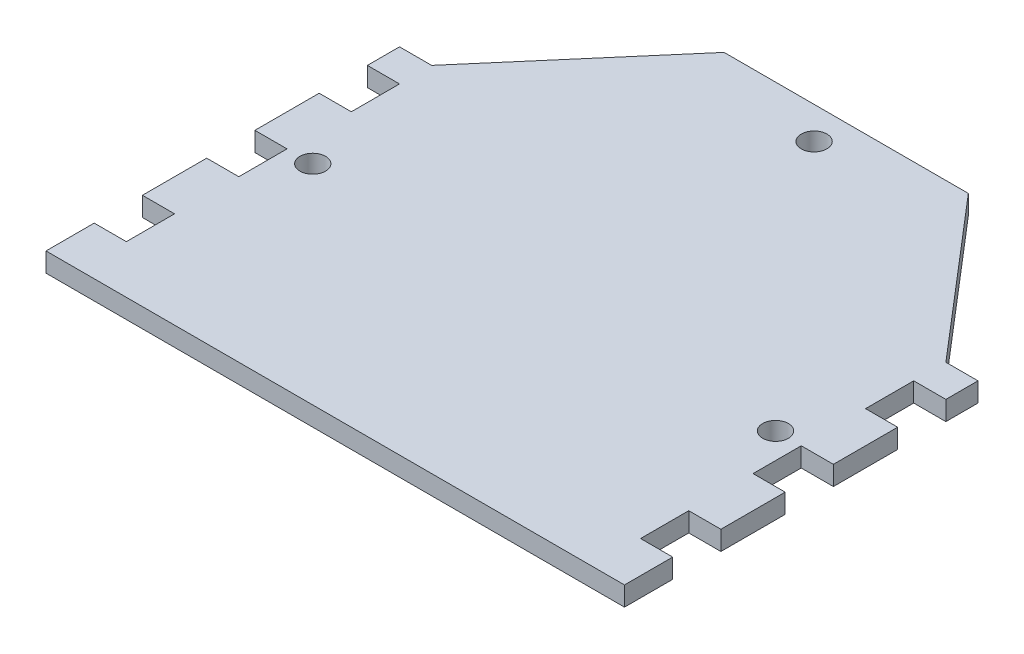
ISO-10303-21;
HEADER;
FILE_DESCRIPTION(('STEP AP214'),'2;1');
FILE_NAME('part.step','',(''),(''),'','','');
FILE_SCHEMA(('AUTOMOTIVE_DESIGN { 1 0 10303 214 1 1 1 1 }'));
ENDSEC;
DATA;
#1=APPLICATION_CONTEXT('core data for automotive mechanical design processes');
#2=APPLICATION_PROTOCOL_DEFINITION('international standard','automotive_design',2000,#1);
#3=PRODUCT_CONTEXT('',#1,'mechanical');
#4=PRODUCT('Part','Part','',(#3));
#5=PRODUCT_RELATED_PRODUCT_CATEGORY('part','',(#4));
#6=PRODUCT_DEFINITION_FORMATION('','',#4);
#7=PRODUCT_DEFINITION_CONTEXT('part definition',#1,'design');
#8=PRODUCT_DEFINITION('design','',#6,#7);
#9=PRODUCT_DEFINITION_SHAPE('','',#8);
#10=(LENGTH_UNIT() NAMED_UNIT(*) SI_UNIT(.MILLI.,.METRE.));
#11=(NAMED_UNIT(*) PLANE_ANGLE_UNIT() SI_UNIT($,.RADIAN.));
#12=(NAMED_UNIT(*) SI_UNIT($,.STERADIAN.) SOLID_ANGLE_UNIT());
#13=UNCERTAINTY_MEASURE_WITH_UNIT(LENGTH_MEASURE(1.E-05),#10,'distance_accuracy_value','');
#14=(GEOMETRIC_REPRESENTATION_CONTEXT(3) GLOBAL_UNCERTAINTY_ASSIGNED_CONTEXT((#13)) GLOBAL_UNIT_ASSIGNED_CONTEXT((#10,
#11,#12)) REPRESENTATION_CONTEXT('',''));
#15=CARTESIAN_POINT('',(0.,0.,0.));
#16=DIRECTION('',(0.,0.,1.));
#17=DIRECTION('',(1.,0.,0.));
#18=AXIS2_PLACEMENT_3D('',#15,#16,#17);
#19=CARTESIAN_POINT('',(0.,3.,0.));
#20=DIRECTION('',(0.,-1.,0.));
#21=DIRECTION('',(0.,0.,-1.));
#22=AXIS2_PLACEMENT_3D('',#19,#20,#21);
#23=PLANE('',#22);
#24=DIRECTION('',(0.,0.,1.));
#25=VECTOR('',#24,1.);
#26=CARTESIAN_POINT('',(-45.,3.,-10.5));
#27=LINE('',#26,#25);
#28=CARTESIAN_POINT('',(-45.,3.,-10.5));
#29=VERTEX_POINT('',#28);
#30=CARTESIAN_POINT('',(-45.,3.,-5.49999999999999));
#31=VERTEX_POINT('',#30);
#32=EDGE_CURVE('E340',#29,#31,#27,.T.);
#33=ORIENTED_EDGE('',*,*,#32,.T.);
#34=DIRECTION('',(1.,0.,0.));
#35=VECTOR('',#34,1.);
#36=CARTESIAN_POINT('',(-40.,3.,-5.49999999999999));
#37=LINE('',#36,#35);
#38=CARTESIAN_POINT('',(-40.,3.,-5.49999999999999));
#39=VERTEX_POINT('',#38);
#40=EDGE_CURVE('E167',#31,#39,#37,.T.);
#41=ORIENTED_EDGE('',*,*,#40,.T.);
#42=DIRECTION('',(0.,0.,1.));
#43=VECTOR('',#42,1.);
#44=CARTESIAN_POINT('',(-40.,3.,-5.49999999999999));
#45=LINE('',#44,#43);
#46=CARTESIAN_POINT('',(-40.,3.,2.00000000000001));
#47=VERTEX_POINT('',#46);
#48=EDGE_CURVE('E427',#39,#47,#45,.T.);
#49=ORIENTED_EDGE('',*,*,#48,.T.);
#50=DIRECTION('',(-1.,0.,0.));
#51=VECTOR('',#50,1.);
#52=CARTESIAN_POINT('',(-45.,3.,2.00000000000001));
#53=LINE('',#52,#51);
#54=CARTESIAN_POINT('',(-45.,3.,2.00000000000001));
#55=VERTEX_POINT('',#54);
#56=EDGE_CURVE('E446',#47,#55,#53,.T.);
#57=ORIENTED_EDGE('',*,*,#56,.T.);
#58=DIRECTION('',(0.,0.,1.));
#59=VECTOR('',#58,1.);
#60=CARTESIAN_POINT('',(-45.,3.,2.00000000000001));
#61=LINE('',#60,#59);
#62=CARTESIAN_POINT('',(-45.,3.,12.));
#63=VERTEX_POINT('',#62);
#64=EDGE_CURVE('E443',#55,#63,#61,.T.);
#65=ORIENTED_EDGE('',*,*,#64,.T.);
#66=DIRECTION('',(1.,0.,0.));
#67=VECTOR('',#66,1.);
#68=CARTESIAN_POINT('',(-40.,3.,12.));
#69=LINE('',#68,#67);
#70=CARTESIAN_POINT('',(-40.,3.,12.));
#71=VERTEX_POINT('',#70);
#72=EDGE_CURVE('E445',#63,#71,#69,.T.);
#73=ORIENTED_EDGE('',*,*,#72,.T.);
#74=DIRECTION('',(0.,0.,1.));
#75=VECTOR('',#74,1.);
#76=CARTESIAN_POINT('',(-40.,3.,12.));
#77=LINE('',#76,#75);
#78=CARTESIAN_POINT('',(-40.,3.,19.5));
#79=VERTEX_POINT('',#78);
#80=EDGE_CURVE('E448',#71,#79,#77,.T.);
#81=ORIENTED_EDGE('',*,*,#80,.T.);
#82=DIRECTION('',(-1.,0.,0.));
#83=VECTOR('',#82,1.);
#84=CARTESIAN_POINT('',(-40.,3.,19.5));
#85=LINE('',#84,#83);
#86=CARTESIAN_POINT('',(-45.,3.,19.5));
#87=VERTEX_POINT('',#86);
#88=EDGE_CURVE('E454',#79,#87,#85,.T.);
#89=ORIENTED_EDGE('',*,*,#88,.T.);
#90=DIRECTION('',(0.,0.,1.));
#91=VECTOR('',#90,1.);
#92=CARTESIAN_POINT('',(-45.,3.,19.5));
#93=LINE('',#92,#91);
#94=CARTESIAN_POINT('',(-45.,3.,29.5));
#95=VERTEX_POINT('',#94);
#96=EDGE_CURVE('E456',#87,#95,#93,.T.);
#97=ORIENTED_EDGE('',*,*,#96,.T.);
#98=DIRECTION('',(1.,0.,0.));
#99=VECTOR('',#98,1.);
#100=CARTESIAN_POINT('',(-45.,3.,29.5));
#101=LINE('',#100,#99);
#102=CARTESIAN_POINT('',(-40.,3.,29.5));
#103=VERTEX_POINT('',#102);
#104=EDGE_CURVE('E458',#95,#103,#101,.T.);
#105=ORIENTED_EDGE('',*,*,#104,.T.);
#106=DIRECTION('',(0.,0.,1.));
#107=VECTOR('',#106,1.);
#108=CARTESIAN_POINT('',(-40.,3.,29.5));
#109=LINE('',#108,#107);
#110=CARTESIAN_POINT('',(-40.,3.,37.));
#111=VERTEX_POINT('',#110);
#112=EDGE_CURVE('E460',#103,#111,#109,.T.);
#113=ORIENTED_EDGE('',*,*,#112,.T.);
#114=DIRECTION('',(-1.,0.,0.));
#115=VECTOR('',#114,1.);
#116=CARTESIAN_POINT('',(-40.,3.,37.));
#117=LINE('',#116,#115);
#118=CARTESIAN_POINT('',(-45.,3.,37.));
#119=VERTEX_POINT('',#118);
#120=EDGE_CURVE('E462',#111,#119,#117,.T.);
#121=ORIENTED_EDGE('',*,*,#120,.T.);
#122=DIRECTION('',(0.,0.,1.));
#123=VECTOR('',#122,1.);
#124=CARTESIAN_POINT('',(-45.,3.,37.));
#125=LINE('',#124,#123);
#126=CARTESIAN_POINT('',(-45.,3.,44.5));
#127=VERTEX_POINT('',#126);
#128=EDGE_CURVE('E464',#119,#127,#125,.T.);
#129=ORIENTED_EDGE('',*,*,#128,.T.);
#130=DIRECTION('',(1.,0.,0.));
#131=VECTOR('',#130,1.);
#132=CARTESIAN_POINT('',(-45.,3.,44.5));
#133=LINE('',#132,#131);
#134=CARTESIAN_POINT('',(45.,3.,44.5));
#135=VERTEX_POINT('',#134);
#136=EDGE_CURVE('E466',#127,#135,#133,.T.);
#137=ORIENTED_EDGE('',*,*,#136,.T.);
#138=DIRECTION('',(0.,0.,-1.));
#139=VECTOR('',#138,1.);
#140=CARTESIAN_POINT('',(45.,3.,37.));
#141=LINE('',#140,#139);
#142=CARTESIAN_POINT('',(45.,3.,37.));
#143=VERTEX_POINT('',#142);
#144=EDGE_CURVE('E468',#135,#143,#141,.T.);
#145=ORIENTED_EDGE('',*,*,#144,.T.);
#146=DIRECTION('',(-1.,0.,0.));
#147=VECTOR('',#146,1.);
#148=CARTESIAN_POINT('',(40.,3.,37.));
#149=LINE('',#148,#147);
#150=CARTESIAN_POINT('',(40.,3.,37.));
#151=VERTEX_POINT('',#150);
#152=EDGE_CURVE('E470',#143,#151,#149,.T.);
#153=ORIENTED_EDGE('',*,*,#152,.T.);
#154=DIRECTION('',(0.,0.,-1.));
#155=VECTOR('',#154,1.);
#156=CARTESIAN_POINT('',(40.,3.,37.));
#157=LINE('',#156,#155);
#158=CARTESIAN_POINT('',(40.,3.,29.5));
#159=VERTEX_POINT('',#158);
#160=EDGE_CURVE('E472',#151,#159,#157,.T.);
#161=ORIENTED_EDGE('',*,*,#160,.T.);
#162=DIRECTION('',(1.,0.,0.));
#163=VECTOR('',#162,1.);
#164=CARTESIAN_POINT('',(45.,3.,29.5));
#165=LINE('',#164,#163);
#166=CARTESIAN_POINT('',(45.,3.,29.5));
#167=VERTEX_POINT('',#166);
#168=EDGE_CURVE('E474',#159,#167,#165,.T.);
#169=ORIENTED_EDGE('',*,*,#168,.T.);
#170=DIRECTION('',(0.,0.,-1.));
#171=VECTOR('',#170,1.);
#172=CARTESIAN_POINT('',(45.,3.,29.5));
#173=LINE('',#172,#171);
#174=CARTESIAN_POINT('',(45.,3.,19.5));
#175=VERTEX_POINT('',#174);
#176=EDGE_CURVE('E476',#167,#175,#173,.T.);
#177=ORIENTED_EDGE('',*,*,#176,.T.);
#178=DIRECTION('',(-1.,0.,0.));
#179=VECTOR('',#178,1.);
#180=CARTESIAN_POINT('',(40.,3.,19.5));
#181=LINE('',#180,#179);
#182=CARTESIAN_POINT('',(40.,3.,19.5));
#183=VERTEX_POINT('',#182);
#184=EDGE_CURVE('E478',#175,#183,#181,.T.);
#185=ORIENTED_EDGE('',*,*,#184,.T.);
#186=DIRECTION('',(0.,0.,-1.));
#187=VECTOR('',#186,1.);
#188=CARTESIAN_POINT('',(40.,3.,12.));
#189=LINE('',#188,#187);
#190=CARTESIAN_POINT('',(40.,3.,12.));
#191=VERTEX_POINT('',#190);
#192=EDGE_CURVE('E480',#183,#191,#189,.T.);
#193=ORIENTED_EDGE('',*,*,#192,.T.);
#194=DIRECTION('',(1.,0.,0.));
#195=VECTOR('',#194,1.);
#196=CARTESIAN_POINT('',(40.,3.,12.));
#197=LINE('',#196,#195);
#198=CARTESIAN_POINT('',(45.,3.,12.));
#199=VERTEX_POINT('',#198);
#200=EDGE_CURVE('E482',#191,#199,#197,.T.);
#201=ORIENTED_EDGE('',*,*,#200,.T.);
#202=DIRECTION('',(0.,0.,-1.));
#203=VECTOR('',#202,1.);
#204=CARTESIAN_POINT('',(45.,3.,12.));
#205=LINE('',#204,#203);
#206=CARTESIAN_POINT('',(45.,3.,2.00000000000001));
#207=VERTEX_POINT('',#206);
#208=EDGE_CURVE('E484',#199,#207,#205,.T.);
#209=ORIENTED_EDGE('',*,*,#208,.T.);
#210=DIRECTION('',(-1.,0.,0.));
#211=VECTOR('',#210,1.);
#212=CARTESIAN_POINT('',(45.,3.,2.00000000000001));
#213=LINE('',#212,#211);
#214=CARTESIAN_POINT('',(40.,3.,2.00000000000001));
#215=VERTEX_POINT('',#214);
#216=EDGE_CURVE('E486',#207,#215,#213,.T.);
#217=ORIENTED_EDGE('',*,*,#216,.T.);
#218=DIRECTION('',(0.,0.,-1.));
#219=VECTOR('',#218,1.);
#220=CARTESIAN_POINT('',(40.,3.,-5.49999999999999));
#221=LINE('',#220,#219);
#222=CARTESIAN_POINT('',(40.,3.,-5.49999999999999));
#223=VERTEX_POINT('',#222);
#224=EDGE_CURVE('E488',#215,#223,#221,.T.);
#225=ORIENTED_EDGE('',*,*,#224,.T.);
#226=DIRECTION('',(1.,0.,0.));
#227=VECTOR('',#226,1.);
#228=CARTESIAN_POINT('',(40.,3.,-5.49999999999999));
#229=LINE('',#228,#227);
#230=CARTESIAN_POINT('',(45.,3.,-5.49999999999999));
#231=VERTEX_POINT('',#230);
#232=EDGE_CURVE('E490',#223,#231,#229,.T.);
#233=ORIENTED_EDGE('',*,*,#232,.T.);
#234=DIRECTION('',(0.,0.,-1.));
#235=VECTOR('',#234,1.);
#236=CARTESIAN_POINT('',(45.,3.,-10.5));
#237=LINE('',#236,#235);
#238=CARTESIAN_POINT('',(45.,3.,-10.5));
#239=VERTEX_POINT('',#238);
#240=EDGE_CURVE('E492',#231,#239,#237,.T.);
#241=ORIENTED_EDGE('',*,*,#240,.T.);
#242=DIRECTION('',(-1.,0.,0.));
#243=VECTOR('',#242,1.);
#244=CARTESIAN_POINT('',(40.,3.,-10.5));
#245=LINE('',#244,#243);
#246=CARTESIAN_POINT('',(40.,3.,-10.5));
#247=VERTEX_POINT('',#246);
#248=EDGE_CURVE('E494',#239,#247,#245,.T.);
#249=ORIENTED_EDGE('',*,*,#248,.T.);
#250=DIRECTION('',(-0.650791373455968,0.,-0.759256602365297));
#251=VECTOR('',#250,1.);
#252=CARTESIAN_POINT('',(19.,3.,-35.));
#253=LINE('',#252,#251);
#254=CARTESIAN_POINT('',(19.,3.,-35.));
#255=VERTEX_POINT('',#254);
#256=EDGE_CURVE('E258',#247,#255,#253,.T.);
#257=ORIENTED_EDGE('',*,*,#256,.T.);
#258=DIRECTION('',(-1.,0.,0.));
#259=VECTOR('',#258,1.);
#260=CARTESIAN_POINT('',(19.,3.,-35.));
#261=LINE('',#260,#259);
#262=CARTESIAN_POINT('',(-19.,3.,-35.));
#263=VERTEX_POINT('',#262);
#264=EDGE_CURVE('E252',#255,#263,#261,.T.);
#265=ORIENTED_EDGE('',*,*,#264,.T.);
#266=DIRECTION('',(-0.650791373455968,0.,0.759256602365297));
#267=VECTOR('',#266,1.);
#268=CARTESIAN_POINT('',(-19.,3.,-35.));
#269=LINE('',#268,#267);
#270=CARTESIAN_POINT('',(-40.,3.,-10.5));
#271=VERTEX_POINT('',#270);
#272=EDGE_CURVE('E256',#263,#271,#269,.T.);
#273=ORIENTED_EDGE('',*,*,#272,.T.);
#274=DIRECTION('',(-1.,0.,0.));
#275=VECTOR('',#274,1.);
#276=CARTESIAN_POINT('',(-40.,3.,-10.5));
#277=LINE('',#276,#275);
#278=EDGE_CURVE('E52',#271,#29,#277,.T.);
#279=ORIENTED_EDGE('',*,*,#278,.T.);
#280=EDGE_LOOP('',(#33,#41,#49,#57,#65,#73,#81,#89,#97,#105,#113,#121,#129,#137,#145,#153,#161,
#169,#177,#185,#193,#201,#209,#217,#225,#233,#241,#249,#257,#265,#273,#279));
#281=FACE_BOUND('',#280,.T.);
#282=CARTESIAN_POINT('',(-36.,3.,12.));
#283=DIRECTION('',(0.,1.,0.));
#284=DIRECTION('',(0.,0.,1.));
#285=AXIS2_PLACEMENT_3D('',#282,#283,#284);
#286=CIRCLE('',#285,2.);
#287=CARTESIAN_POINT('',(-36.,3.,14.));
#288=VERTEX_POINT('',#287);
#289=EDGE_CURVE('E280',#288,#288,#286,.T.);
#290=ORIENTED_EDGE('',*,*,#289,.F.);
#291=EDGE_LOOP('',(#290));
#292=FACE_BOUND('',#291,.T.);
#293=CARTESIAN_POINT('',(36.,3.,12.));
#294=DIRECTION('',(0.,1.,0.));
#295=DIRECTION('',(0.,0.,1.));
#296=AXIS2_PLACEMENT_3D('',#293,#294,#295);
#297=CIRCLE('',#296,2.);
#298=CARTESIAN_POINT('',(36.,3.,14.));
#299=VERTEX_POINT('',#298);
#300=EDGE_CURVE('E548',#299,#299,#297,.T.);
#301=ORIENTED_EDGE('',*,*,#300,.F.);
#302=EDGE_LOOP('',(#301));
#303=FACE_BOUND('',#302,.T.);
#304=CARTESIAN_POINT('',(0.,3.,-30.));
#305=DIRECTION('',(0.,1.,0.));
#306=DIRECTION('',(0.,0.,1.));
#307=AXIS2_PLACEMENT_3D('',#304,#305,#306);
#308=CIRCLE('',#307,2.);
#309=CARTESIAN_POINT('',(0.,3.,-28.));
#310=VERTEX_POINT('',#309);
#311=EDGE_CURVE('E539',#310,#310,#308,.T.);
#312=ORIENTED_EDGE('',*,*,#311,.F.);
#313=EDGE_LOOP('',(#312));
#314=FACE_BOUND('',#313,.T.);
#315=ADVANCED_FACE('F35',(#281,#292,#303,#314),#23,.F.);
#316=CARTESIAN_POINT('',(0.,0.,0.));
#317=DIRECTION('',(0.,-1.,0.));
#318=DIRECTION('',(0.,0.,-1.));
#319=AXIS2_PLACEMENT_3D('',#316,#317,#318);
#320=PLANE('',#319);
#321=CARTESIAN_POINT('',(36.,0.,12.));
#322=DIRECTION('',(0.,1.,0.));
#323=DIRECTION('',(0.,0.,1.));
#324=AXIS2_PLACEMENT_3D('',#321,#322,#323);
#325=CIRCLE('',#324,2.);
#326=CARTESIAN_POINT('',(36.,0.,14.));
#327=VERTEX_POINT('',#326);
#328=EDGE_CURVE('E545',#327,#327,#325,.T.);
#329=ORIENTED_EDGE('',*,*,#328,.T.);
#330=EDGE_LOOP('',(#329));
#331=FACE_BOUND('',#330,.T.);
#332=DIRECTION('',(0.,0.,1.));
#333=VECTOR('',#332,1.);
#334=CARTESIAN_POINT('',(-45.,0.,-10.5));
#335=LINE('',#334,#333);
#336=CARTESIAN_POINT('',(-45.,0.,-10.5));
#337=VERTEX_POINT('',#336);
#338=CARTESIAN_POINT('',(-45.,0.,-5.49999999999999));
#339=VERTEX_POINT('',#338);
#340=EDGE_CURVE('E276',#337,#339,#335,.T.);
#341=ORIENTED_EDGE('',*,*,#340,.F.);
#342=DIRECTION('',(-1.,0.,0.));
#343=VECTOR('',#342,1.);
#344=CARTESIAN_POINT('',(-40.,0.,-10.5));
#345=LINE('',#344,#343);
#346=CARTESIAN_POINT('',(-40.,0.,-10.5));
#347=VERTEX_POINT('',#346);
#348=EDGE_CURVE('E159',#347,#337,#345,.T.);
#349=ORIENTED_EDGE('',*,*,#348,.F.);
#350=DIRECTION('',(-0.650791373455968,0.,0.759256602365297));
#351=VECTOR('',#350,1.);
#352=CARTESIAN_POINT('',(-19.,0.,-35.));
#353=LINE('',#352,#351);
#354=CARTESIAN_POINT('',(-19.,0.,-35.));
#355=VERTEX_POINT('',#354);
#356=EDGE_CURVE('E153',#355,#347,#353,.T.);
#357=ORIENTED_EDGE('',*,*,#356,.F.);
#358=DIRECTION('',(-1.,0.,0.));
#359=VECTOR('',#358,1.);
#360=CARTESIAN_POINT('',(19.,0.,-35.));
#361=LINE('',#360,#359);
#362=CARTESIAN_POINT('',(19.,0.,-35.));
#363=VERTEX_POINT('',#362);
#364=EDGE_CURVE('E266',#363,#355,#361,.T.);
#365=ORIENTED_EDGE('',*,*,#364,.F.);
#366=DIRECTION('',(-0.650791373455968,0.,-0.759256602365297));
#367=VECTOR('',#366,1.);
#368=CARTESIAN_POINT('',(19.,0.,-35.));
#369=LINE('',#368,#367);
#370=CARTESIAN_POINT('',(40.,0.,-10.5));
#371=VERTEX_POINT('',#370);
#372=EDGE_CURVE('E335',#371,#363,#369,.T.);
#373=ORIENTED_EDGE('',*,*,#372,.F.);
#374=DIRECTION('',(-1.,0.,0.));
#375=VECTOR('',#374,1.);
#376=CARTESIAN_POINT('',(40.,0.,-10.5));
#377=LINE('',#376,#375);
#378=CARTESIAN_POINT('',(45.,0.,-10.5));
#379=VERTEX_POINT('',#378);
#380=EDGE_CURVE('E333',#379,#371,#377,.T.);
#381=ORIENTED_EDGE('',*,*,#380,.F.);
#382=DIRECTION('',(0.,0.,-1.));
#383=VECTOR('',#382,1.);
#384=CARTESIAN_POINT('',(45.,0.,-10.5));
#385=LINE('',#384,#383);
#386=CARTESIAN_POINT('',(45.,0.,-5.49999999999999));
#387=VERTEX_POINT('',#386);
#388=EDGE_CURVE('E331',#387,#379,#385,.T.);
#389=ORIENTED_EDGE('',*,*,#388,.F.);
#390=DIRECTION('',(1.,0.,0.));
#391=VECTOR('',#390,1.);
#392=CARTESIAN_POINT('',(40.,0.,-5.49999999999999));
#393=LINE('',#392,#391);
#394=CARTESIAN_POINT('',(40.,0.,-5.49999999999999));
#395=VERTEX_POINT('',#394);
#396=EDGE_CURVE('E329',#395,#387,#393,.T.);
#397=ORIENTED_EDGE('',*,*,#396,.F.);
#398=DIRECTION('',(0.,0.,-1.));
#399=VECTOR('',#398,1.);
#400=CARTESIAN_POINT('',(40.,0.,-5.49999999999999));
#401=LINE('',#400,#399);
#402=CARTESIAN_POINT('',(40.,0.,2.00000000000001));
#403=VERTEX_POINT('',#402);
#404=EDGE_CURVE('E327',#403,#395,#401,.T.);
#405=ORIENTED_EDGE('',*,*,#404,.F.);
#406=DIRECTION('',(-1.,0.,0.));
#407=VECTOR('',#406,1.);
#408=CARTESIAN_POINT('',(45.,0.,2.00000000000001));
#409=LINE('',#408,#407);
#410=CARTESIAN_POINT('',(45.,0.,2.00000000000001));
#411=VERTEX_POINT('',#410);
#412=EDGE_CURVE('E325',#411,#403,#409,.T.);
#413=ORIENTED_EDGE('',*,*,#412,.F.);
#414=DIRECTION('',(0.,0.,-1.));
#415=VECTOR('',#414,1.);
#416=CARTESIAN_POINT('',(45.,0.,12.));
#417=LINE('',#416,#415);
#418=CARTESIAN_POINT('',(45.,0.,12.));
#419=VERTEX_POINT('',#418);
#420=EDGE_CURVE('E323',#419,#411,#417,.T.);
#421=ORIENTED_EDGE('',*,*,#420,.F.);
#422=DIRECTION('',(1.,0.,0.));
#423=VECTOR('',#422,1.);
#424=CARTESIAN_POINT('',(40.,0.,12.));
#425=LINE('',#424,#423);
#426=CARTESIAN_POINT('',(40.,0.,12.));
#427=VERTEX_POINT('',#426);
#428=EDGE_CURVE('E321',#427,#419,#425,.T.);
#429=ORIENTED_EDGE('',*,*,#428,.F.);
#430=DIRECTION('',(0.,0.,-1.));
#431=VECTOR('',#430,1.);
#432=CARTESIAN_POINT('',(40.,0.,12.));
#433=LINE('',#432,#431);
#434=CARTESIAN_POINT('',(40.,0.,19.5));
#435=VERTEX_POINT('',#434);
#436=EDGE_CURVE('E319',#435,#427,#433,.T.);
#437=ORIENTED_EDGE('',*,*,#436,.F.);
#438=DIRECTION('',(-1.,0.,0.));
#439=VECTOR('',#438,1.);
#440=CARTESIAN_POINT('',(40.,0.,19.5));
#441=LINE('',#440,#439);
#442=CARTESIAN_POINT('',(45.,0.,19.5));
#443=VERTEX_POINT('',#442);
#444=EDGE_CURVE('E317',#443,#435,#441,.T.);
#445=ORIENTED_EDGE('',*,*,#444,.F.);
#446=DIRECTION('',(0.,0.,-1.));
#447=VECTOR('',#446,1.);
#448=CARTESIAN_POINT('',(45.,0.,29.5));
#449=LINE('',#448,#447);
#450=CARTESIAN_POINT('',(45.,0.,29.5));
#451=VERTEX_POINT('',#450);
#452=EDGE_CURVE('E315',#451,#443,#449,.T.);
#453=ORIENTED_EDGE('',*,*,#452,.F.);
#454=DIRECTION('',(1.,0.,0.));
#455=VECTOR('',#454,1.);
#456=CARTESIAN_POINT('',(45.,0.,29.5));
#457=LINE('',#456,#455);
#458=CARTESIAN_POINT('',(40.,0.,29.5));
#459=VERTEX_POINT('',#458);
#460=EDGE_CURVE('E313',#459,#451,#457,.T.);
#461=ORIENTED_EDGE('',*,*,#460,.F.);
#462=DIRECTION('',(0.,0.,-1.));
#463=VECTOR('',#462,1.);
#464=CARTESIAN_POINT('',(40.,0.,37.));
#465=LINE('',#464,#463);
#466=CARTESIAN_POINT('',(40.,0.,37.));
#467=VERTEX_POINT('',#466);
#468=EDGE_CURVE('E311',#467,#459,#465,.T.);
#469=ORIENTED_EDGE('',*,*,#468,.F.);
#470=DIRECTION('',(-1.,0.,0.));
#471=VECTOR('',#470,1.);
#472=CARTESIAN_POINT('',(40.,0.,37.));
#473=LINE('',#472,#471);
#474=CARTESIAN_POINT('',(45.,0.,37.));
#475=VERTEX_POINT('',#474);
#476=EDGE_CURVE('E309',#475,#467,#473,.T.);
#477=ORIENTED_EDGE('',*,*,#476,.F.);
#478=DIRECTION('',(0.,0.,-1.));
#479=VECTOR('',#478,1.);
#480=CARTESIAN_POINT('',(45.,0.,37.));
#481=LINE('',#480,#479);
#482=CARTESIAN_POINT('',(45.,0.,44.5));
#483=VERTEX_POINT('',#482);
#484=EDGE_CURVE('E307',#483,#475,#481,.T.);
#485=ORIENTED_EDGE('',*,*,#484,.F.);
#486=DIRECTION('',(1.,0.,0.));
#487=VECTOR('',#486,1.);
#488=CARTESIAN_POINT('',(45.,0.,44.5));
#489=LINE('',#488,#487);
#490=CARTESIAN_POINT('',(-45.,0.,44.5));
#491=VERTEX_POINT('',#490);
#492=EDGE_CURVE('E305',#491,#483,#489,.T.);
#493=ORIENTED_EDGE('',*,*,#492,.F.);
#494=DIRECTION('',(0.,0.,1.));
#495=VECTOR('',#494,1.);
#496=CARTESIAN_POINT('',(-45.,0.,37.));
#497=LINE('',#496,#495);
#498=CARTESIAN_POINT('',(-45.,0.,37.));
#499=VERTEX_POINT('',#498);
#500=EDGE_CURVE('E302',#499,#491,#497,.T.);
#501=ORIENTED_EDGE('',*,*,#500,.F.);
#502=DIRECTION('',(-1.,0.,0.));
#503=VECTOR('',#502,1.);
#504=CARTESIAN_POINT('',(-40.,0.,37.));
#505=LINE('',#504,#503);
#506=CARTESIAN_POINT('',(-40.,0.,37.));
#507=VERTEX_POINT('',#506);
#508=EDGE_CURVE('E300',#507,#499,#505,.T.);
#509=ORIENTED_EDGE('',*,*,#508,.F.);
#510=DIRECTION('',(0.,0.,1.));
#511=VECTOR('',#510,1.);
#512=CARTESIAN_POINT('',(-40.,0.,29.5));
#513=LINE('',#512,#511);
#514=CARTESIAN_POINT('',(-40.,0.,29.5));
#515=VERTEX_POINT('',#514);
#516=EDGE_CURVE('E298',#515,#507,#513,.T.);
#517=ORIENTED_EDGE('',*,*,#516,.F.);
#518=DIRECTION('',(1.,0.,0.));
#519=VECTOR('',#518,1.);
#520=CARTESIAN_POINT('',(-45.,0.,29.5));
#521=LINE('',#520,#519);
#522=CARTESIAN_POINT('',(-45.,0.,29.5));
#523=VERTEX_POINT('',#522);
#524=EDGE_CURVE('E296',#523,#515,#521,.T.);
#525=ORIENTED_EDGE('',*,*,#524,.F.);
#526=DIRECTION('',(0.,0.,1.));
#527=VECTOR('',#526,1.);
#528=CARTESIAN_POINT('',(-45.,0.,19.5));
#529=LINE('',#528,#527);
#530=CARTESIAN_POINT('',(-45.,0.,19.5));
#531=VERTEX_POINT('',#530);
#532=EDGE_CURVE('E294',#531,#523,#529,.T.);
#533=ORIENTED_EDGE('',*,*,#532,.F.);
#534=DIRECTION('',(-1.,0.,0.));
#535=VECTOR('',#534,1.);
#536=CARTESIAN_POINT('',(-40.,0.,19.5));
#537=LINE('',#536,#535);
#538=CARTESIAN_POINT('',(-40.,0.,19.5));
#539=VERTEX_POINT('',#538);
#540=EDGE_CURVE('E292',#539,#531,#537,.T.);
#541=ORIENTED_EDGE('',*,*,#540,.F.);
#542=DIRECTION('',(0.,0.,1.));
#543=VECTOR('',#542,1.);
#544=CARTESIAN_POINT('',(-40.,0.,12.));
#545=LINE('',#544,#543);
#546=CARTESIAN_POINT('',(-40.,0.,12.));
#547=VERTEX_POINT('',#546);
#548=EDGE_CURVE('E290',#547,#539,#545,.T.);
#549=ORIENTED_EDGE('',*,*,#548,.F.);
#550=DIRECTION('',(1.,0.,0.));
#551=VECTOR('',#550,1.);
#552=CARTESIAN_POINT('',(-40.,0.,12.));
#553=LINE('',#552,#551);
#554=CARTESIAN_POINT('',(-45.,0.,12.));
#555=VERTEX_POINT('',#554);
#556=EDGE_CURVE('E288',#555,#547,#553,.T.);
#557=ORIENTED_EDGE('',*,*,#556,.F.);
#558=DIRECTION('',(0.,0.,1.));
#559=VECTOR('',#558,1.);
#560=CARTESIAN_POINT('',(-45.,0.,2.00000000000001));
#561=LINE('',#560,#559);
#562=CARTESIAN_POINT('',(-45.,0.,2.00000000000001));
#563=VERTEX_POINT('',#562);
#564=EDGE_CURVE('E286',#563,#555,#561,.T.);
#565=ORIENTED_EDGE('',*,*,#564,.F.);
#566=DIRECTION('',(-1.,0.,0.));
#567=VECTOR('',#566,1.);
#568=CARTESIAN_POINT('',(-45.,0.,2.00000000000001));
#569=LINE('',#568,#567);
#570=CARTESIAN_POINT('',(-40.,0.,2.00000000000001));
#571=VERTEX_POINT('',#570);
#572=EDGE_CURVE('E284',#571,#563,#569,.T.);
#573=ORIENTED_EDGE('',*,*,#572,.F.);
#574=DIRECTION('',(0.,0.,1.));
#575=VECTOR('',#574,1.);
#576=CARTESIAN_POINT('',(-40.,0.,-5.49999999999999));
#577=LINE('',#576,#575);
#578=CARTESIAN_POINT('',(-40.,0.,-5.49999999999999));
#579=VERTEX_POINT('',#578);
#580=EDGE_CURVE('E282',#579,#571,#577,.T.);
#581=ORIENTED_EDGE('',*,*,#580,.F.);
#582=DIRECTION('',(1.,0.,0.));
#583=VECTOR('',#582,1.);
#584=CARTESIAN_POINT('',(-40.,0.,-5.49999999999999));
#585=LINE('',#584,#583);
#586=EDGE_CURVE('E279',#339,#579,#585,.T.);
#587=ORIENTED_EDGE('',*,*,#586,.F.);
#588=EDGE_LOOP('',(#341,#349,#357,#365,#373,#381,#389,#397,#405,#413,#421,#429,#437,#445,#453,
#461,#469,#477,#485,#493,#501,#509,#517,#525,#533,#541,#549,#557,#565,#573,#581,#587));
#589=FACE_BOUND('',#588,.T.);
#590=CARTESIAN_POINT('',(-36.,0.,12.));
#591=DIRECTION('',(0.,1.,0.));
#592=DIRECTION('',(0.,0.,1.));
#593=AXIS2_PLACEMENT_3D('',#590,#591,#592);
#594=CIRCLE('',#593,2.);
#595=CARTESIAN_POINT('',(-36.,0.,14.));
#596=VERTEX_POINT('',#595);
#597=EDGE_CURVE('E551',#596,#596,#594,.T.);
#598=ORIENTED_EDGE('',*,*,#597,.T.);
#599=EDGE_LOOP('',(#598));
#600=FACE_BOUND('',#599,.T.);
#601=CARTESIAN_POINT('',(0.,0.,-30.));
#602=DIRECTION('',(0.,1.,0.));
#603=DIRECTION('',(0.,0.,1.));
#604=AXIS2_PLACEMENT_3D('',#601,#602,#603);
#605=CIRCLE('',#604,2.);
#606=CARTESIAN_POINT('',(0.,0.,-28.));
#607=VERTEX_POINT('',#606);
#608=EDGE_CURVE('E542',#607,#607,#605,.T.);
#609=ORIENTED_EDGE('',*,*,#608,.T.);
#610=EDGE_LOOP('',(#609));
#611=FACE_BOUND('',#610,.T.);
#612=ADVANCED_FACE('F431',(#331,#589,#600,#611),#320,.T.);
#613=CARTESIAN_POINT('',(-45.,3.,-10.5));
#614=DIRECTION('',(1.,0.,0.));
#615=DIRECTION('',(0.,0.,-1.));
#616=AXIS2_PLACEMENT_3D('',#613,#614,#615);
#617=PLANE('',#616);
#618=ORIENTED_EDGE('',*,*,#340,.T.);
#619=DIRECTION('',(0.,-1.,0.));
#620=VECTOR('',#619,1.);
#621=CARTESIAN_POINT('',(-45.,3.,-5.49999999999999));
#622=LINE('',#621,#620);
#623=EDGE_CURVE('E11',#31,#339,#622,.T.);
#624=ORIENTED_EDGE('',*,*,#623,.F.);
#625=ORIENTED_EDGE('',*,*,#32,.F.);
#626=DIRECTION('',(0.,-1.,0.));
#627=VECTOR('',#626,1.);
#628=CARTESIAN_POINT('',(-45.,3.,-10.5));
#629=LINE('',#628,#627);
#630=EDGE_CURVE('E272',#29,#337,#629,.T.);
#631=ORIENTED_EDGE('',*,*,#630,.T.);
#632=EDGE_LOOP('',(#618,#624,#625,#631));
#633=FACE_BOUND('',#632,.T.);
#634=ADVANCED_FACE('F37',(#633),#617,.F.);
#635=CARTESIAN_POINT('',(-40.,3.,-5.49999999999999));
#636=DIRECTION('',(0.,0.,-1.));
#637=DIRECTION('',(-1.,0.,0.));
#638=AXIS2_PLACEMENT_3D('',#635,#636,#637);
#639=PLANE('',#638);
#640=ORIENTED_EDGE('',*,*,#586,.T.);
#641=DIRECTION('',(0.,-1.,0.));
#642=VECTOR('',#641,1.);
#643=CARTESIAN_POINT('',(-40.,3.,-5.49999999999999));
#644=LINE('',#643,#642);
#645=EDGE_CURVE('E44',#39,#579,#644,.T.);
#646=ORIENTED_EDGE('',*,*,#645,.F.);
#647=ORIENTED_EDGE('',*,*,#40,.F.);
#648=ORIENTED_EDGE('',*,*,#623,.T.);
#649=EDGE_LOOP('',(#640,#646,#647,#648));
#650=FACE_BOUND('',#649,.T.);
#651=ADVANCED_FACE('F869',(#650),#639,.F.);
#652=CARTESIAN_POINT('',(-40.,3.,-5.49999999999999));
#653=DIRECTION('',(1.,0.,0.));
#654=DIRECTION('',(0.,0.,-1.));
#655=AXIS2_PLACEMENT_3D('',#652,#653,#654);
#656=PLANE('',#655);
#657=ORIENTED_EDGE('',*,*,#580,.T.);
#658=DIRECTION('',(0.,-1.,0.));
#659=VECTOR('',#658,1.);
#660=CARTESIAN_POINT('',(-40.,3.,2.00000000000001));
#661=LINE('',#660,#659);
#662=EDGE_CURVE('E419',#47,#571,#661,.T.);
#663=ORIENTED_EDGE('',*,*,#662,.F.);
#664=ORIENTED_EDGE('',*,*,#48,.F.);
#665=ORIENTED_EDGE('',*,*,#645,.T.);
#666=EDGE_LOOP('',(#657,#663,#664,#665));
#667=FACE_BOUND('',#666,.T.);
#668=ADVANCED_FACE('F425',(#667),#656,.F.);
#669=CARTESIAN_POINT('',(-45.,3.,2.00000000000001));
#670=DIRECTION('',(0.,0.,1.));
#671=DIRECTION('',(1.,0.,0.));
#672=AXIS2_PLACEMENT_3D('',#669,#670,#671);
#673=PLANE('',#672);
#674=ORIENTED_EDGE('',*,*,#572,.T.);
#675=DIRECTION('',(0.,-1.,0.));
#676=VECTOR('',#675,1.);
#677=CARTESIAN_POINT('',(-45.,3.,2.00000000000001));
#678=LINE('',#677,#676);
#679=EDGE_CURVE('E416',#55,#563,#678,.T.);
#680=ORIENTED_EDGE('',*,*,#679,.F.);
#681=ORIENTED_EDGE('',*,*,#56,.F.);
#682=ORIENTED_EDGE('',*,*,#662,.T.);
#683=EDGE_LOOP('',(#674,#680,#681,#682));
#684=FACE_BOUND('',#683,.T.);
#685=ADVANCED_FACE('F437',(#684),#673,.F.);
#686=CARTESIAN_POINT('',(-45.,3.,2.00000000000001));
#687=DIRECTION('',(1.,0.,0.));
#688=DIRECTION('',(0.,0.,-1.));
#689=AXIS2_PLACEMENT_3D('',#686,#687,#688);
#690=PLANE('',#689);
#691=ORIENTED_EDGE('',*,*,#564,.T.);
#692=DIRECTION('',(0.,-1.,0.));
#693=VECTOR('',#692,1.);
#694=CARTESIAN_POINT('',(-45.,3.,12.));
#695=LINE('',#694,#693);
#696=EDGE_CURVE('E413',#63,#555,#695,.T.);
#697=ORIENTED_EDGE('',*,*,#696,.F.);
#698=ORIENTED_EDGE('',*,*,#64,.F.);
#699=ORIENTED_EDGE('',*,*,#679,.T.);
#700=EDGE_LOOP('',(#691,#697,#698,#699));
#701=FACE_BOUND('',#700,.T.);
#702=ADVANCED_FACE('F441',(#701),#690,.F.);
#703=CARTESIAN_POINT('',(-40.,3.,12.));
#704=DIRECTION('',(0.,0.,-1.));
#705=DIRECTION('',(-1.,0.,0.));
#706=AXIS2_PLACEMENT_3D('',#703,#704,#705);
#707=PLANE('',#706);
#708=ORIENTED_EDGE('',*,*,#556,.T.);
#709=DIRECTION('',(0.,-1.,0.));
#710=VECTOR('',#709,1.);
#711=CARTESIAN_POINT('',(-40.,3.,12.));
#712=LINE('',#711,#710);
#713=EDGE_CURVE('E410',#71,#547,#712,.T.);
#714=ORIENTED_EDGE('',*,*,#713,.F.);
#715=ORIENTED_EDGE('',*,*,#72,.F.);
#716=ORIENTED_EDGE('',*,*,#696,.T.);
#717=EDGE_LOOP('',(#708,#714,#715,#716));
#718=FACE_BOUND('',#717,.T.);
#719=ADVANCED_FACE('F834',(#718),#707,.F.);
#720=CARTESIAN_POINT('',(-40.,3.,12.));
#721=DIRECTION('',(1.,0.,0.));
#722=DIRECTION('',(0.,0.,-1.));
#723=AXIS2_PLACEMENT_3D('',#720,#721,#722);
#724=PLANE('',#723);
#725=ORIENTED_EDGE('',*,*,#548,.T.);
#726=DIRECTION('',(0.,-1.,0.));
#727=VECTOR('',#726,1.);
#728=CARTESIAN_POINT('',(-40.,3.,19.5));
#729=LINE('',#728,#727);
#730=EDGE_CURVE('E407',#79,#539,#729,.T.);
#731=ORIENTED_EDGE('',*,*,#730,.F.);
#732=ORIENTED_EDGE('',*,*,#80,.F.);
#733=ORIENTED_EDGE('',*,*,#713,.T.);
#734=EDGE_LOOP('',(#725,#731,#732,#733));
#735=FACE_BOUND('',#734,.T.);
#736=ADVANCED_FACE('F824',(#735),#724,.F.);
#737=CARTESIAN_POINT('',(-40.,3.,19.5));
#738=DIRECTION('',(0.,0.,1.));
#739=DIRECTION('',(1.,0.,0.));
#740=AXIS2_PLACEMENT_3D('',#737,#738,#739);
#741=PLANE('',#740);
#742=ORIENTED_EDGE('',*,*,#540,.T.);
#743=DIRECTION('',(0.,-1.,0.));
#744=VECTOR('',#743,1.);
#745=CARTESIAN_POINT('',(-45.,3.,19.5));
#746=LINE('',#745,#744);
#747=EDGE_CURVE('E404',#87,#531,#746,.T.);
#748=ORIENTED_EDGE('',*,*,#747,.F.);
#749=ORIENTED_EDGE('',*,*,#88,.F.);
#750=ORIENTED_EDGE('',*,*,#730,.T.);
#751=EDGE_LOOP('',(#742,#748,#749,#750));
#752=FACE_BOUND('',#751,.T.);
#753=ADVANCED_FACE('F814',(#752),#741,.F.);
#754=CARTESIAN_POINT('',(-45.,3.,19.5));
#755=DIRECTION('',(1.,0.,0.));
#756=DIRECTION('',(0.,0.,-1.));
#757=AXIS2_PLACEMENT_3D('',#754,#755,#756);
#758=PLANE('',#757);
#759=ORIENTED_EDGE('',*,*,#532,.T.);
#760=DIRECTION('',(0.,-1.,0.));
#761=VECTOR('',#760,1.);
#762=CARTESIAN_POINT('',(-45.,3.,29.5));
#763=LINE('',#762,#761);
#764=EDGE_CURVE('E401',#95,#523,#763,.T.);
#765=ORIENTED_EDGE('',*,*,#764,.F.);
#766=ORIENTED_EDGE('',*,*,#96,.F.);
#767=ORIENTED_EDGE('',*,*,#747,.T.);
#768=EDGE_LOOP('',(#759,#765,#766,#767));
#769=FACE_BOUND('',#768,.T.);
#770=ADVANCED_FACE('F804',(#769),#758,.F.);
#771=CARTESIAN_POINT('',(-45.,3.,29.5));
#772=DIRECTION('',(0.,0.,-1.));
#773=DIRECTION('',(-1.,0.,0.));
#774=AXIS2_PLACEMENT_3D('',#771,#772,#773);
#775=PLANE('',#774);
#776=ORIENTED_EDGE('',*,*,#524,.T.);
#777=DIRECTION('',(0.,-1.,0.));
#778=VECTOR('',#777,1.);
#779=CARTESIAN_POINT('',(-40.,3.,29.5));
#780=LINE('',#779,#778);
#781=EDGE_CURVE('E398',#103,#515,#780,.T.);
#782=ORIENTED_EDGE('',*,*,#781,.F.);
#783=ORIENTED_EDGE('',*,*,#104,.F.);
#784=ORIENTED_EDGE('',*,*,#764,.T.);
#785=EDGE_LOOP('',(#776,#782,#783,#784));
#786=FACE_BOUND('',#785,.T.);
#787=ADVANCED_FACE('F794',(#786),#775,.F.);
#788=CARTESIAN_POINT('',(-40.,3.,29.5));
#789=DIRECTION('',(1.,0.,0.));
#790=DIRECTION('',(0.,0.,-1.));
#791=AXIS2_PLACEMENT_3D('',#788,#789,#790);
#792=PLANE('',#791);
#793=ORIENTED_EDGE('',*,*,#516,.T.);
#794=DIRECTION('',(0.,-1.,0.));
#795=VECTOR('',#794,1.);
#796=CARTESIAN_POINT('',(-40.,3.,37.));
#797=LINE('',#796,#795);
#798=EDGE_CURVE('E395',#111,#507,#797,.T.);
#799=ORIENTED_EDGE('',*,*,#798,.F.);
#800=ORIENTED_EDGE('',*,*,#112,.F.);
#801=ORIENTED_EDGE('',*,*,#781,.T.);
#802=EDGE_LOOP('',(#793,#799,#800,#801));
#803=FACE_BOUND('',#802,.T.);
#804=ADVANCED_FACE('F784',(#803),#792,.F.);
#805=CARTESIAN_POINT('',(-40.,3.,37.));
#806=DIRECTION('',(0.,0.,1.));
#807=DIRECTION('',(1.,0.,0.));
#808=AXIS2_PLACEMENT_3D('',#805,#806,#807);
#809=PLANE('',#808);
#810=ORIENTED_EDGE('',*,*,#508,.T.);
#811=DIRECTION('',(0.,-1.,0.));
#812=VECTOR('',#811,1.);
#813=CARTESIAN_POINT('',(-45.,3.,37.));
#814=LINE('',#813,#812);
#815=EDGE_CURVE('E392',#119,#499,#814,.T.);
#816=ORIENTED_EDGE('',*,*,#815,.F.);
#817=ORIENTED_EDGE('',*,*,#120,.F.);
#818=ORIENTED_EDGE('',*,*,#798,.T.);
#819=EDGE_LOOP('',(#810,#816,#817,#818));
#820=FACE_BOUND('',#819,.T.);
#821=ADVANCED_FACE('F773',(#820),#809,.F.);
#822=CARTESIAN_POINT('',(-45.,3.,37.));
#823=DIRECTION('',(1.,0.,0.));
#824=DIRECTION('',(0.,0.,-1.));
#825=AXIS2_PLACEMENT_3D('',#822,#823,#824);
#826=PLANE('',#825);
#827=ORIENTED_EDGE('',*,*,#500,.T.);
#828=DIRECTION('',(0.,-1.,0.));
#829=VECTOR('',#828,1.);
#830=CARTESIAN_POINT('',(-45.,3.,44.5));
#831=LINE('',#830,#829);
#832=EDGE_CURVE('E389',#127,#491,#831,.T.);
#833=ORIENTED_EDGE('',*,*,#832,.F.);
#834=ORIENTED_EDGE('',*,*,#128,.F.);
#835=ORIENTED_EDGE('',*,*,#815,.T.);
#836=EDGE_LOOP('',(#827,#833,#834,#835));
#837=FACE_BOUND('',#836,.T.);
#838=ADVANCED_FACE('F762',(#837),#826,.F.);
#839=CARTESIAN_POINT('',(45.,3.,44.5));
#840=DIRECTION('',(0.,0.,-1.));
#841=DIRECTION('',(-1.,0.,0.));
#842=AXIS2_PLACEMENT_3D('',#839,#840,#841);
#843=PLANE('',#842);
#844=ORIENTED_EDGE('',*,*,#492,.T.);
#845=DIRECTION('',(0.,-1.,0.));
#846=VECTOR('',#845,1.);
#847=CARTESIAN_POINT('',(45.,3.,44.5));
#848=LINE('',#847,#846);
#849=EDGE_CURVE('E386',#135,#483,#848,.T.);
#850=ORIENTED_EDGE('',*,*,#849,.F.);
#851=ORIENTED_EDGE('',*,*,#136,.F.);
#852=ORIENTED_EDGE('',*,*,#832,.T.);
#853=EDGE_LOOP('',(#844,#850,#851,#852));
#854=FACE_BOUND('',#853,.T.);
#855=ADVANCED_FACE('F752',(#854),#843,.F.);
#856=CARTESIAN_POINT('',(45.,3.,37.));
#857=DIRECTION('',(-1.,0.,0.));
#858=DIRECTION('',(0.,0.,1.));
#859=AXIS2_PLACEMENT_3D('',#856,#857,#858);
#860=PLANE('',#859);
#861=ORIENTED_EDGE('',*,*,#484,.T.);
#862=DIRECTION('',(0.,-1.,0.));
#863=VECTOR('',#862,1.);
#864=CARTESIAN_POINT('',(45.,3.,37.));
#865=LINE('',#864,#863);
#866=EDGE_CURVE('E383',#143,#475,#865,.T.);
#867=ORIENTED_EDGE('',*,*,#866,.F.);
#868=ORIENTED_EDGE('',*,*,#144,.F.);
#869=ORIENTED_EDGE('',*,*,#849,.T.);
#870=EDGE_LOOP('',(#861,#867,#868,#869));
#871=FACE_BOUND('',#870,.T.);
#872=ADVANCED_FACE('F742',(#871),#860,.F.);
#873=CARTESIAN_POINT('',(40.,3.,37.));
#874=DIRECTION('',(0.,0.,1.));
#875=DIRECTION('',(1.,0.,0.));
#876=AXIS2_PLACEMENT_3D('',#873,#874,#875);
#877=PLANE('',#876);
#878=ORIENTED_EDGE('',*,*,#476,.T.);
#879=DIRECTION('',(0.,-1.,0.));
#880=VECTOR('',#879,1.);
#881=CARTESIAN_POINT('',(40.,3.,37.));
#882=LINE('',#881,#880);
#883=EDGE_CURVE('E380',#151,#467,#882,.T.);
#884=ORIENTED_EDGE('',*,*,#883,.F.);
#885=ORIENTED_EDGE('',*,*,#152,.F.);
#886=ORIENTED_EDGE('',*,*,#866,.T.);
#887=EDGE_LOOP('',(#878,#884,#885,#886));
#888=FACE_BOUND('',#887,.T.);
#889=ADVANCED_FACE('F732',(#888),#877,.F.);
#890=CARTESIAN_POINT('',(40.,3.,37.));
#891=DIRECTION('',(-1.,0.,0.));
#892=DIRECTION('',(0.,0.,1.));
#893=AXIS2_PLACEMENT_3D('',#890,#891,#892);
#894=PLANE('',#893);
#895=ORIENTED_EDGE('',*,*,#468,.T.);
#896=DIRECTION('',(0.,-1.,0.));
#897=VECTOR('',#896,1.);
#898=CARTESIAN_POINT('',(40.,3.,29.5));
#899=LINE('',#898,#897);
#900=EDGE_CURVE('E377',#159,#459,#899,.T.);
#901=ORIENTED_EDGE('',*,*,#900,.F.);
#902=ORIENTED_EDGE('',*,*,#160,.F.);
#903=ORIENTED_EDGE('',*,*,#883,.T.);
#904=EDGE_LOOP('',(#895,#901,#902,#903));
#905=FACE_BOUND('',#904,.T.);
#906=ADVANCED_FACE('F722',(#905),#894,.F.);
#907=CARTESIAN_POINT('',(45.,3.,29.5));
#908=DIRECTION('',(0.,0.,-1.));
#909=DIRECTION('',(-1.,0.,0.));
#910=AXIS2_PLACEMENT_3D('',#907,#908,#909);
#911=PLANE('',#910);
#912=ORIENTED_EDGE('',*,*,#460,.T.);
#913=DIRECTION('',(0.,-1.,0.));
#914=VECTOR('',#913,1.);
#915=CARTESIAN_POINT('',(45.,3.,29.5));
#916=LINE('',#915,#914);
#917=EDGE_CURVE('E374',#167,#451,#916,.T.);
#918=ORIENTED_EDGE('',*,*,#917,.F.);
#919=ORIENTED_EDGE('',*,*,#168,.F.);
#920=ORIENTED_EDGE('',*,*,#900,.T.);
#921=EDGE_LOOP('',(#912,#918,#919,#920));
#922=FACE_BOUND('',#921,.T.);
#923=ADVANCED_FACE('F712',(#922),#911,.F.);
#924=CARTESIAN_POINT('',(45.,3.,29.5));
#925=DIRECTION('',(-1.,0.,0.));
#926=DIRECTION('',(0.,0.,1.));
#927=AXIS2_PLACEMENT_3D('',#924,#925,#926);
#928=PLANE('',#927);
#929=ORIENTED_EDGE('',*,*,#452,.T.);
#930=DIRECTION('',(0.,-1.,0.));
#931=VECTOR('',#930,1.);
#932=CARTESIAN_POINT('',(45.,3.,19.5));
#933=LINE('',#932,#931);
#934=EDGE_CURVE('E371',#175,#443,#933,.T.);
#935=ORIENTED_EDGE('',*,*,#934,.F.);
#936=ORIENTED_EDGE('',*,*,#176,.F.);
#937=ORIENTED_EDGE('',*,*,#917,.T.);
#938=EDGE_LOOP('',(#929,#935,#936,#937));
#939=FACE_BOUND('',#938,.T.);
#940=ADVANCED_FACE('F702',(#939),#928,.F.);
#941=CARTESIAN_POINT('',(40.,3.,19.5));
#942=DIRECTION('',(0.,0.,1.));
#943=DIRECTION('',(1.,0.,0.));
#944=AXIS2_PLACEMENT_3D('',#941,#942,#943);
#945=PLANE('',#944);
#946=ORIENTED_EDGE('',*,*,#444,.T.);
#947=DIRECTION('',(0.,-1.,0.));
#948=VECTOR('',#947,1.);
#949=CARTESIAN_POINT('',(40.,3.,19.5));
#950=LINE('',#949,#948);
#951=EDGE_CURVE('E368',#183,#435,#950,.T.);
#952=ORIENTED_EDGE('',*,*,#951,.F.);
#953=ORIENTED_EDGE('',*,*,#184,.F.);
#954=ORIENTED_EDGE('',*,*,#934,.T.);
#955=EDGE_LOOP('',(#946,#952,#953,#954));
#956=FACE_BOUND('',#955,.T.);
#957=ADVANCED_FACE('F692',(#956),#945,.F.);
#958=CARTESIAN_POINT('',(40.,3.,12.));
#959=DIRECTION('',(-1.,0.,0.));
#960=DIRECTION('',(0.,0.,1.));
#961=AXIS2_PLACEMENT_3D('',#958,#959,#960);
#962=PLANE('',#961);
#963=ORIENTED_EDGE('',*,*,#436,.T.);
#964=DIRECTION('',(0.,-1.,0.));
#965=VECTOR('',#964,1.);
#966=CARTESIAN_POINT('',(40.,3.,12.));
#967=LINE('',#966,#965);
#968=EDGE_CURVE('E365',#191,#427,#967,.T.);
#969=ORIENTED_EDGE('',*,*,#968,.F.);
#970=ORIENTED_EDGE('',*,*,#192,.F.);
#971=ORIENTED_EDGE('',*,*,#951,.T.);
#972=EDGE_LOOP('',(#963,#969,#970,#971));
#973=FACE_BOUND('',#972,.T.);
#974=ADVANCED_FACE('F682',(#973),#962,.F.);
#975=CARTESIAN_POINT('',(40.,3.,12.));
#976=DIRECTION('',(0.,0.,-1.));
#977=DIRECTION('',(-1.,0.,0.));
#978=AXIS2_PLACEMENT_3D('',#975,#976,#977);
#979=PLANE('',#978);
#980=ORIENTED_EDGE('',*,*,#428,.T.);
#981=DIRECTION('',(0.,-1.,0.));
#982=VECTOR('',#981,1.);
#983=CARTESIAN_POINT('',(45.,3.,12.));
#984=LINE('',#983,#982);
#985=EDGE_CURVE('E362',#199,#419,#984,.T.);
#986=ORIENTED_EDGE('',*,*,#985,.F.);
#987=ORIENTED_EDGE('',*,*,#200,.F.);
#988=ORIENTED_EDGE('',*,*,#968,.T.);
#989=EDGE_LOOP('',(#980,#986,#987,#988));
#990=FACE_BOUND('',#989,.T.);
#991=ADVANCED_FACE('F672',(#990),#979,.F.);
#992=CARTESIAN_POINT('',(45.,3.,12.));
#993=DIRECTION('',(-1.,0.,0.));
#994=DIRECTION('',(0.,0.,1.));
#995=AXIS2_PLACEMENT_3D('',#992,#993,#994);
#996=PLANE('',#995);
#997=ORIENTED_EDGE('',*,*,#420,.T.);
#998=DIRECTION('',(0.,-1.,0.));
#999=VECTOR('',#998,1.);
#1000=CARTESIAN_POINT('',(45.,3.,2.00000000000001));
#1001=LINE('',#1000,#999);
#1002=EDGE_CURVE('E359',#207,#411,#1001,.T.);
#1003=ORIENTED_EDGE('',*,*,#1002,.F.);
#1004=ORIENTED_EDGE('',*,*,#208,.F.);
#1005=ORIENTED_EDGE('',*,*,#985,.T.);
#1006=EDGE_LOOP('',(#997,#1003,#1004,#1005));
#1007=FACE_BOUND('',#1006,.T.);
#1008=ADVANCED_FACE('F662',(#1007),#996,.F.);
#1009=CARTESIAN_POINT('',(45.,3.,2.00000000000001));
#1010=DIRECTION('',(0.,0.,1.));
#1011=DIRECTION('',(1.,0.,0.));
#1012=AXIS2_PLACEMENT_3D('',#1009,#1010,#1011);
#1013=PLANE('',#1012);
#1014=ORIENTED_EDGE('',*,*,#412,.T.);
#1015=DIRECTION('',(0.,-1.,0.));
#1016=VECTOR('',#1015,1.);
#1017=CARTESIAN_POINT('',(40.,3.,2.00000000000001));
#1018=LINE('',#1017,#1016);
#1019=EDGE_CURVE('E356',#215,#403,#1018,.T.);
#1020=ORIENTED_EDGE('',*,*,#1019,.F.);
#1021=ORIENTED_EDGE('',*,*,#216,.F.);
#1022=ORIENTED_EDGE('',*,*,#1002,.T.);
#1023=EDGE_LOOP('',(#1014,#1020,#1021,#1022));
#1024=FACE_BOUND('',#1023,.T.);
#1025=ADVANCED_FACE('F652',(#1024),#1013,.F.);
#1026=CARTESIAN_POINT('',(40.,3.,-5.49999999999999));
#1027=DIRECTION('',(-1.,0.,0.));
#1028=DIRECTION('',(0.,0.,1.));
#1029=AXIS2_PLACEMENT_3D('',#1026,#1027,#1028);
#1030=PLANE('',#1029);
#1031=ORIENTED_EDGE('',*,*,#404,.T.);
#1032=DIRECTION('',(0.,-1.,0.));
#1033=VECTOR('',#1032,1.);
#1034=CARTESIAN_POINT('',(40.,3.,-5.49999999999999));
#1035=LINE('',#1034,#1033);
#1036=EDGE_CURVE('E353',#223,#395,#1035,.T.);
#1037=ORIENTED_EDGE('',*,*,#1036,.F.);
#1038=ORIENTED_EDGE('',*,*,#224,.F.);
#1039=ORIENTED_EDGE('',*,*,#1019,.T.);
#1040=EDGE_LOOP('',(#1031,#1037,#1038,#1039));
#1041=FACE_BOUND('',#1040,.T.);
#1042=ADVANCED_FACE('F642',(#1041),#1030,.F.);
#1043=CARTESIAN_POINT('',(40.,3.,-5.49999999999999));
#1044=DIRECTION('',(0.,0.,-1.));
#1045=DIRECTION('',(-1.,0.,0.));
#1046=AXIS2_PLACEMENT_3D('',#1043,#1044,#1045);
#1047=PLANE('',#1046);
#1048=ORIENTED_EDGE('',*,*,#396,.T.);
#1049=DIRECTION('',(0.,-1.,0.));
#1050=VECTOR('',#1049,1.);
#1051=CARTESIAN_POINT('',(45.,3.,-5.49999999999999));
#1052=LINE('',#1051,#1050);
#1053=EDGE_CURVE('E350',#231,#387,#1052,.T.);
#1054=ORIENTED_EDGE('',*,*,#1053,.F.);
#1055=ORIENTED_EDGE('',*,*,#232,.F.);
#1056=ORIENTED_EDGE('',*,*,#1036,.T.);
#1057=EDGE_LOOP('',(#1048,#1054,#1055,#1056));
#1058=FACE_BOUND('',#1057,.T.);
#1059=ADVANCED_FACE('F632',(#1058),#1047,.F.);
#1060=CARTESIAN_POINT('',(45.,3.,-10.5));
#1061=DIRECTION('',(-1.,0.,0.));
#1062=DIRECTION('',(0.,0.,1.));
#1063=AXIS2_PLACEMENT_3D('',#1060,#1061,#1062);
#1064=PLANE('',#1063);
#1065=ORIENTED_EDGE('',*,*,#388,.T.);
#1066=DIRECTION('',(0.,-1.,0.));
#1067=VECTOR('',#1066,1.);
#1068=CARTESIAN_POINT('',(45.,3.,-10.5));
#1069=LINE('',#1068,#1067);
#1070=EDGE_CURVE('E347',#239,#379,#1069,.T.);
#1071=ORIENTED_EDGE('',*,*,#1070,.F.);
#1072=ORIENTED_EDGE('',*,*,#240,.F.);
#1073=ORIENTED_EDGE('',*,*,#1053,.T.);
#1074=EDGE_LOOP('',(#1065,#1071,#1072,#1073));
#1075=FACE_BOUND('',#1074,.T.);
#1076=ADVANCED_FACE('F623',(#1075),#1064,.F.);
#1077=CARTESIAN_POINT('',(40.,3.,-10.5));
#1078=DIRECTION('',(0.,0.,1.));
#1079=DIRECTION('',(1.,0.,0.));
#1080=AXIS2_PLACEMENT_3D('',#1077,#1078,#1079);
#1081=PLANE('',#1080);
#1082=ORIENTED_EDGE('',*,*,#380,.T.);
#1083=DIRECTION('',(0.,-1.,0.));
#1084=VECTOR('',#1083,1.);
#1085=CARTESIAN_POINT('',(40.,3.,-10.5));
#1086=LINE('',#1085,#1084);
#1087=EDGE_CURVE('E344',#247,#371,#1086,.T.);
#1088=ORIENTED_EDGE('',*,*,#1087,.F.);
#1089=ORIENTED_EDGE('',*,*,#248,.F.);
#1090=ORIENTED_EDGE('',*,*,#1070,.T.);
#1091=EDGE_LOOP('',(#1082,#1088,#1089,#1090));
#1092=FACE_BOUND('',#1091,.T.);
#1093=ADVANCED_FACE('F500',(#1092),#1081,.F.);
#1094=CARTESIAN_POINT('',(19.,3.,-35.));
#1095=DIRECTION('',(-0.759256602365297,0.,0.650791373455968));
#1096=DIRECTION('',(0.650791373455968,0.,0.759256602365297));
#1097=AXIS2_PLACEMENT_3D('',#1094,#1095,#1096);
#1098=PLANE('',#1097);
#1099=ORIENTED_EDGE('',*,*,#372,.T.);
#1100=DIRECTION('',(0.,-1.,0.));
#1101=VECTOR('',#1100,1.);
#1102=CARTESIAN_POINT('',(19.,3.,-35.));
#1103=LINE('',#1102,#1101);
#1104=EDGE_CURVE('E267',#255,#363,#1103,.T.);
#1105=ORIENTED_EDGE('',*,*,#1104,.F.);
#1106=ORIENTED_EDGE('',*,*,#256,.F.);
#1107=ORIENTED_EDGE('',*,*,#1087,.T.);
#1108=EDGE_LOOP('',(#1099,#1105,#1106,#1107));
#1109=FACE_BOUND('',#1108,.T.);
#1110=ADVANCED_FACE('F504',(#1109),#1098,.F.);
#1111=CARTESIAN_POINT('',(19.,3.,-35.));
#1112=DIRECTION('',(0.,0.,1.));
#1113=DIRECTION('',(1.,0.,0.));
#1114=AXIS2_PLACEMENT_3D('',#1111,#1112,#1113);
#1115=PLANE('',#1114);
#1116=ORIENTED_EDGE('',*,*,#364,.T.);
#1117=DIRECTION('',(0.,-1.,0.));
#1118=VECTOR('',#1117,1.);
#1119=CARTESIAN_POINT('',(-19.,3.,-35.));
#1120=LINE('',#1119,#1118);
#1121=EDGE_CURVE('E263',#263,#355,#1120,.T.);
#1122=ORIENTED_EDGE('',*,*,#1121,.F.);
#1123=ORIENTED_EDGE('',*,*,#264,.F.);
#1124=ORIENTED_EDGE('',*,*,#1104,.T.);
#1125=EDGE_LOOP('',(#1116,#1122,#1123,#1124));
#1126=FACE_BOUND('',#1125,.T.);
#1127=ADVANCED_FACE('F264',(#1126),#1115,.F.);
#1128=CARTESIAN_POINT('',(-19.,3.,-35.));
#1129=DIRECTION('',(0.759256602365297,0.,0.650791373455968));
#1130=DIRECTION('',(0.650791373455968,0.,-0.759256602365297));
#1131=AXIS2_PLACEMENT_3D('',#1128,#1129,#1130);
#1132=PLANE('',#1131);
#1133=ORIENTED_EDGE('',*,*,#356,.T.);
#1134=DIRECTION('',(0.,-1.,0.));
#1135=VECTOR('',#1134,1.);
#1136=CARTESIAN_POINT('',(-40.,3.,-10.5));
#1137=LINE('',#1136,#1135);
#1138=EDGE_CURVE('E268',#271,#347,#1137,.T.);
#1139=ORIENTED_EDGE('',*,*,#1138,.F.);
#1140=ORIENTED_EDGE('',*,*,#272,.F.);
#1141=ORIENTED_EDGE('',*,*,#1121,.T.);
#1142=EDGE_LOOP('',(#1133,#1139,#1140,#1141));
#1143=FACE_BOUND('',#1142,.T.);
#1144=ADVANCED_FACE('F270',(#1143),#1132,.F.);
#1145=CARTESIAN_POINT('',(-40.,3.,-10.5));
#1146=DIRECTION('',(0.,0.,1.));
#1147=DIRECTION('',(1.,0.,0.));
#1148=AXIS2_PLACEMENT_3D('',#1145,#1146,#1147);
#1149=PLANE('',#1148);
#1150=ORIENTED_EDGE('',*,*,#348,.T.);
#1151=ORIENTED_EDGE('',*,*,#630,.F.);
#1152=ORIENTED_EDGE('',*,*,#278,.F.);
#1153=ORIENTED_EDGE('',*,*,#1138,.T.);
#1154=EDGE_LOOP('',(#1150,#1151,#1152,#1153));
#1155=FACE_BOUND('',#1154,.T.);
#1156=ADVANCED_FACE('F508',(#1155),#1149,.F.);
#1157=CARTESIAN_POINT('',(-36.,3.,12.));
#1158=DIRECTION('',(0.,-1.,0.));
#1159=DIRECTION('',(0.,0.,-1.));
#1160=AXIS2_PLACEMENT_3D('',#1157,#1158,#1159);
#1161=CYLINDRICAL_SURFACE('',#1160,2.);
#1162=ORIENTED_EDGE('',*,*,#289,.T.);
#1163=EDGE_LOOP('',(#1162));
#1164=FACE_BOUND('',#1163,.T.);
#1165=ORIENTED_EDGE('',*,*,#597,.F.);
#1166=EDGE_LOOP('',(#1165));
#1167=FACE_BOUND('',#1166,.T.);
#1168=ADVANCED_FACE('F510',(#1164,#1167),#1161,.F.);
#1169=CARTESIAN_POINT('',(36.,3.,12.));
#1170=DIRECTION('',(0.,-1.,0.));
#1171=DIRECTION('',(0.,0.,-1.));
#1172=AXIS2_PLACEMENT_3D('',#1169,#1170,#1171);
#1173=CYLINDRICAL_SURFACE('',#1172,2.);
#1174=ORIENTED_EDGE('',*,*,#300,.T.);
#1175=EDGE_LOOP('',(#1174));
#1176=FACE_BOUND('',#1175,.T.);
#1177=ORIENTED_EDGE('',*,*,#328,.F.);
#1178=EDGE_LOOP('',(#1177));
#1179=FACE_BOUND('',#1178,.T.);
#1180=ADVANCED_FACE('F516',(#1176,#1179),#1173,.F.);
#1181=CARTESIAN_POINT('',(0.,3.,-30.));
#1182=DIRECTION('',(0.,-1.,0.));
#1183=DIRECTION('',(0.,0.,-1.));
#1184=AXIS2_PLACEMENT_3D('',#1181,#1182,#1183);
#1185=CYLINDRICAL_SURFACE('',#1184,2.);
#1186=ORIENTED_EDGE('',*,*,#311,.T.);
#1187=EDGE_LOOP('',(#1186));
#1188=FACE_BOUND('',#1187,.T.);
#1189=ORIENTED_EDGE('',*,*,#608,.F.);
#1190=EDGE_LOOP('',(#1189));
#1191=FACE_BOUND('',#1190,.T.);
#1192=ADVANCED_FACE('F530',(#1188,#1191),#1185,.F.);
#1193=CLOSED_SHELL('',(#315,#612,#634,#651,#668,#685,#702,#719,#736,#753,#770,#787,#804,#821,
#838,#855,#872,#889,#906,#923,#940,#957,#974,#991,#1008,#1025,#1042,#1059,#1076,#1093,#1110,
#1127,#1144,#1156,#1168,#1180,#1192));
#1194=MANIFOLD_SOLID_BREP('B2',#1193);
#1195=ADVANCED_BREP_SHAPE_REPRESENTATION('',(#18,#1194),#14);
#1196=SHAPE_DEFINITION_REPRESENTATION(#9,#1195);
ENDSEC;
END-ISO-10303-21;
